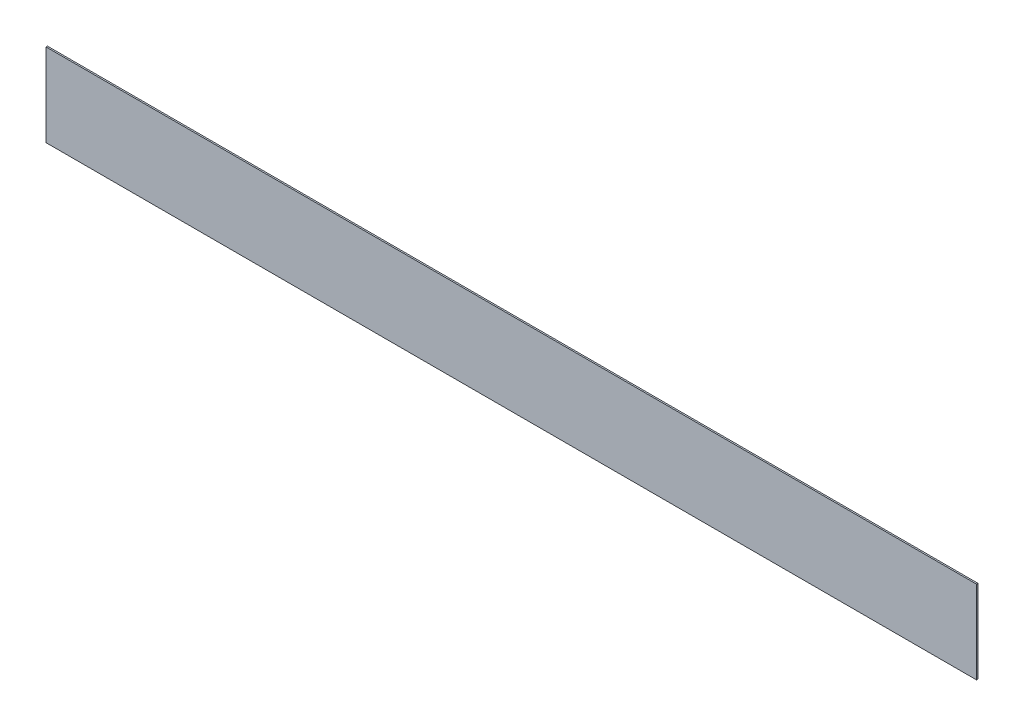
ISO-10303-21;
HEADER;
FILE_DESCRIPTION(('STEP AP214'),'2;1');
FILE_NAME('part.step','',(''),(''),'','','');
FILE_SCHEMA(('AUTOMOTIVE_DESIGN { 1 0 10303 214 1 1 1 1 }'));
ENDSEC;
DATA;
#1=APPLICATION_CONTEXT('core data for automotive mechanical design processes');
#2=APPLICATION_PROTOCOL_DEFINITION('international standard','automotive_design',2000,#1);
#3=PRODUCT_CONTEXT('',#1,'mechanical');
#4=PRODUCT('Part','Part','',(#3));
#5=PRODUCT_RELATED_PRODUCT_CATEGORY('part','',(#4));
#6=PRODUCT_DEFINITION_FORMATION('','',#4);
#7=PRODUCT_DEFINITION_CONTEXT('part definition',#1,'design');
#8=PRODUCT_DEFINITION('design','',#6,#7);
#9=PRODUCT_DEFINITION_SHAPE('','',#8);
#10=(LENGTH_UNIT() NAMED_UNIT(*) SI_UNIT(.MILLI.,.METRE.));
#11=(NAMED_UNIT(*) PLANE_ANGLE_UNIT() SI_UNIT($,.RADIAN.));
#12=(NAMED_UNIT(*) SI_UNIT($,.STERADIAN.) SOLID_ANGLE_UNIT());
#13=UNCERTAINTY_MEASURE_WITH_UNIT(LENGTH_MEASURE(1.E-05),#10,'distance_accuracy_value','');
#14=(GEOMETRIC_REPRESENTATION_CONTEXT(3) GLOBAL_UNCERTAINTY_ASSIGNED_CONTEXT((#13)) GLOBAL_UNIT_ASSIGNED_CONTEXT((#10,
#11,#12)) REPRESENTATION_CONTEXT('',''));
#15=CARTESIAN_POINT('',(0.,0.,0.));
#16=DIRECTION('',(0.,0.,1.));
#17=DIRECTION('',(1.,0.,0.));
#18=AXIS2_PLACEMENT_3D('',#15,#16,#17);
#19=CARTESIAN_POINT('',(0.,0.,1.27));
#20=DIRECTION('',(1.,0.,0.));
#21=DIRECTION('',(0.,0.,-1.));
#22=AXIS2_PLACEMENT_3D('',#19,#20,#21);
#23=PLANE('',#22);
#24=DIRECTION('',(0.,-1.,0.));
#25=VECTOR('',#24,1.);
#26=CARTESIAN_POINT('',(0.,0.,0.));
#27=LINE('',#26,#25);
#28=CARTESIAN_POINT('',(0.,72.46,0.));
#29=VERTEX_POINT('',#28);
#30=CARTESIAN_POINT('',(0.,0.,0.));
#31=VERTEX_POINT('',#30);
#32=EDGE_CURVE('E102',#29,#31,#27,.T.);
#33=ORIENTED_EDGE('',*,*,#32,.T.);
#34=DIRECTION('',(0.,0.,-1.));
#35=VECTOR('',#34,1.);
#36=CARTESIAN_POINT('',(0.,0.,1.27));
#37=LINE('',#36,#35);
#38=CARTESIAN_POINT('',(0.,0.,1.27));
#39=VERTEX_POINT('',#38);
#40=EDGE_CURVE('E11',#39,#31,#37,.T.);
#41=ORIENTED_EDGE('',*,*,#40,.F.);
#42=DIRECTION('',(0.,-1.,0.));
#43=VECTOR('',#42,1.);
#44=CARTESIAN_POINT('',(0.,0.,1.27));
#45=LINE('',#44,#43);
#46=CARTESIAN_POINT('',(0.,72.46,1.27));
#47=VERTEX_POINT('',#46);
#48=EDGE_CURVE('E90',#47,#39,#45,.T.);
#49=ORIENTED_EDGE('',*,*,#48,.F.);
#50=DIRECTION('',(0.,0.,-1.));
#51=VECTOR('',#50,1.);
#52=CARTESIAN_POINT('',(0.,72.46,1.27));
#53=LINE('',#52,#51);
#54=EDGE_CURVE('E98',#47,#29,#53,.T.);
#55=ORIENTED_EDGE('',*,*,#54,.T.);
#56=EDGE_LOOP('',(#33,#41,#49,#55));
#57=FACE_BOUND('',#56,.T.);
#58=ADVANCED_FACE('F39',(#57),#23,.F.);
#59=CARTESIAN_POINT('',(0.,0.,1.27));
#60=DIRECTION('',(0.,1.,0.));
#61=DIRECTION('',(0.,0.,1.));
#62=AXIS2_PLACEMENT_3D('',#59,#60,#61);
#63=PLANE('',#62);
#64=DIRECTION('',(1.,0.,0.));
#65=VECTOR('',#64,1.);
#66=CARTESIAN_POINT('',(0.,0.,0.));
#67=LINE('',#66,#65);
#68=CARTESIAN_POINT('',(813.,0.,0.));
#69=VERTEX_POINT('',#68);
#70=EDGE_CURVE('E94',#31,#69,#67,.T.);
#71=ORIENTED_EDGE('',*,*,#70,.T.);
#72=DIRECTION('',(0.,0.,-1.));
#73=VECTOR('',#72,1.);
#74=CARTESIAN_POINT('',(813.,0.,1.27));
#75=LINE('',#74,#73);
#76=CARTESIAN_POINT('',(813.,0.,1.27));
#77=VERTEX_POINT('',#76);
#78=EDGE_CURVE('E47',#77,#69,#75,.T.);
#79=ORIENTED_EDGE('',*,*,#78,.F.);
#80=DIRECTION('',(1.,0.,0.));
#81=VECTOR('',#80,1.);
#82=CARTESIAN_POINT('',(0.,0.,1.27));
#83=LINE('',#82,#81);
#84=EDGE_CURVE('E85',#39,#77,#83,.T.);
#85=ORIENTED_EDGE('',*,*,#84,.F.);
#86=ORIENTED_EDGE('',*,*,#40,.T.);
#87=EDGE_LOOP('',(#71,#79,#85,#86));
#88=FACE_BOUND('',#87,.T.);
#89=ADVANCED_FACE('F93',(#88),#63,.F.);
#90=CARTESIAN_POINT('',(813.,0.,1.27));
#91=DIRECTION('',(-1.,0.,0.));
#92=DIRECTION('',(0.,0.,1.));
#93=AXIS2_PLACEMENT_3D('',#90,#91,#92);
#94=PLANE('',#93);
#95=DIRECTION('',(0.,1.,0.));
#96=VECTOR('',#95,1.);
#97=CARTESIAN_POINT('',(813.,0.,0.));
#98=LINE('',#97,#96);
#99=CARTESIAN_POINT('',(813.,72.46,0.));
#100=VERTEX_POINT('',#99);
#101=EDGE_CURVE('E72',#69,#100,#98,.T.);
#102=ORIENTED_EDGE('',*,*,#101,.T.);
#103=DIRECTION('',(0.,0.,-1.));
#104=VECTOR('',#103,1.);
#105=CARTESIAN_POINT('',(813.,72.46,1.27));
#106=LINE('',#105,#104);
#107=CARTESIAN_POINT('',(813.,72.46,1.27));
#108=VERTEX_POINT('',#107);
#109=EDGE_CURVE('E95',#108,#100,#106,.T.);
#110=ORIENTED_EDGE('',*,*,#109,.F.);
#111=DIRECTION('',(0.,1.,0.));
#112=VECTOR('',#111,1.);
#113=CARTESIAN_POINT('',(813.,0.,1.27));
#114=LINE('',#113,#112);
#115=EDGE_CURVE('E88',#77,#108,#114,.T.);
#116=ORIENTED_EDGE('',*,*,#115,.F.);
#117=ORIENTED_EDGE('',*,*,#78,.T.);
#118=EDGE_LOOP('',(#102,#110,#116,#117));
#119=FACE_BOUND('',#118,.T.);
#120=ADVANCED_FACE('F96',(#119),#94,.F.);
#121=CARTESIAN_POINT('',(0.,72.46,1.27));
#122=DIRECTION('',(0.,-1.,0.));
#123=DIRECTION('',(0.,0.,-1.));
#124=AXIS2_PLACEMENT_3D('',#121,#122,#123);
#125=PLANE('',#124);
#126=DIRECTION('',(-1.,0.,0.));
#127=VECTOR('',#126,1.);
#128=CARTESIAN_POINT('',(0.,72.46,0.));
#129=LINE('',#128,#127);
#130=EDGE_CURVE('E78',#100,#29,#129,.T.);
#131=ORIENTED_EDGE('',*,*,#130,.T.);
#132=ORIENTED_EDGE('',*,*,#54,.F.);
#133=DIRECTION('',(-1.,0.,0.));
#134=VECTOR('',#133,1.);
#135=CARTESIAN_POINT('',(0.,72.46,1.27));
#136=LINE('',#135,#134);
#137=EDGE_CURVE('E55',#108,#47,#136,.T.);
#138=ORIENTED_EDGE('',*,*,#137,.F.);
#139=ORIENTED_EDGE('',*,*,#109,.T.);
#140=EDGE_LOOP('',(#131,#132,#138,#139));
#141=FACE_BOUND('',#140,.T.);
#142=ADVANCED_FACE('F109',(#141),#125,.F.);
#143=CARTESIAN_POINT('',(0.,0.,1.27));
#144=DIRECTION('',(0.,0.,-1.));
#145=DIRECTION('',(-1.,0.,0.));
#146=AXIS2_PLACEMENT_3D('',#143,#144,#145);
#147=PLANE('',#146);
#148=ORIENTED_EDGE('',*,*,#48,.T.);
#149=ORIENTED_EDGE('',*,*,#84,.T.);
#150=ORIENTED_EDGE('',*,*,#115,.T.);
#151=ORIENTED_EDGE('',*,*,#137,.T.);
#152=EDGE_LOOP('',(#148,#149,#150,#151));
#153=FACE_BOUND('',#152,.T.);
#154=ADVANCED_FACE('F86',(#153),#147,.F.);
#155=CARTESIAN_POINT('',(0.,0.,0.));
#156=DIRECTION('',(0.,0.,-1.));
#157=DIRECTION('',(-1.,0.,0.));
#158=AXIS2_PLACEMENT_3D('',#155,#156,#157);
#159=PLANE('',#158);
#160=ORIENTED_EDGE('',*,*,#32,.F.);
#161=ORIENTED_EDGE('',*,*,#130,.F.);
#162=ORIENTED_EDGE('',*,*,#101,.F.);
#163=ORIENTED_EDGE('',*,*,#70,.F.);
#164=EDGE_LOOP('',(#160,#161,#162,#163));
#165=FACE_BOUND('',#164,.T.);
#166=ADVANCED_FACE('F112',(#165),#159,.T.);
#167=CLOSED_SHELL('',(#58,#89,#120,#142,#154,#166));
#168=MANIFOLD_SOLID_BREP('B2',#167);
#169=ADVANCED_BREP_SHAPE_REPRESENTATION('',(#18,#168),#14);
#170=SHAPE_DEFINITION_REPRESENTATION(#9,#169);
ENDSEC;
END-ISO-10303-21;
